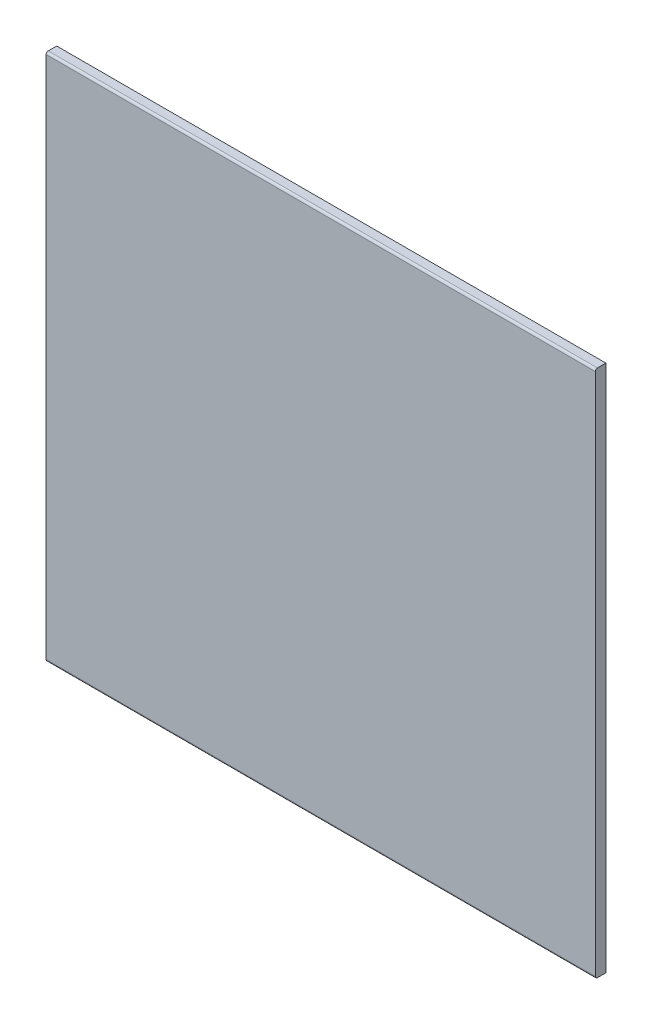
ISO-10303-21;
HEADER;
FILE_DESCRIPTION(('STEP AP214'),'2;1');
FILE_NAME('part.step','',(''),(''),'','','');
FILE_SCHEMA(('AUTOMOTIVE_DESIGN { 1 0 10303 214 1 1 1 1 }'));
ENDSEC;
DATA;
#1=APPLICATION_CONTEXT('core data for automotive mechanical design processes');
#2=APPLICATION_PROTOCOL_DEFINITION('international standard','automotive_design',2000,#1);
#3=PRODUCT_CONTEXT('',#1,'mechanical');
#4=PRODUCT('Part','Part','',(#3));
#5=PRODUCT_RELATED_PRODUCT_CATEGORY('part','',(#4));
#6=PRODUCT_DEFINITION_FORMATION('','',#4);
#7=PRODUCT_DEFINITION_CONTEXT('part definition',#1,'design');
#8=PRODUCT_DEFINITION('design','',#6,#7);
#9=PRODUCT_DEFINITION_SHAPE('','',#8);
#10=(LENGTH_UNIT() NAMED_UNIT(*) SI_UNIT(.MILLI.,.METRE.));
#11=(NAMED_UNIT(*) PLANE_ANGLE_UNIT() SI_UNIT($,.RADIAN.));
#12=(NAMED_UNIT(*) SI_UNIT($,.STERADIAN.) SOLID_ANGLE_UNIT());
#13=UNCERTAINTY_MEASURE_WITH_UNIT(LENGTH_MEASURE(1.E-05),#10,'distance_accuracy_value','');
#14=(GEOMETRIC_REPRESENTATION_CONTEXT(3) GLOBAL_UNCERTAINTY_ASSIGNED_CONTEXT((#13)) GLOBAL_UNIT_ASSIGNED_CONTEXT((#10,
#11,#12)) REPRESENTATION_CONTEXT('',''));
#15=CARTESIAN_POINT('',(0.,0.,0.));
#16=DIRECTION('',(0.,0.,1.));
#17=DIRECTION('',(1.,0.,0.));
#18=AXIS2_PLACEMENT_3D('',#15,#16,#17);
#19=CARTESIAN_POINT('',(0.,0.,0.6));
#20=DIRECTION('',(0.,0.,-1.));
#21=DIRECTION('',(0.,-1.,0.));
#22=AXIS2_PLACEMENT_3D('',#19,#20,#21);
#23=PLANE('',#22);
#24=DIRECTION('',(1.,0.,0.));
#25=VECTOR('',#24,1.);
#26=CARTESIAN_POINT('',(-0.65,1.25,0.6));
#27=LINE('',#26,#25);
#28=CARTESIAN_POINT('',(-1.3,1.25,0.6));
#29=VERTEX_POINT('',#28);
#30=CARTESIAN_POINT('',(1.3,1.25,0.6));
#31=VERTEX_POINT('',#30);
#32=EDGE_CURVE('E130',#29,#31,#27,.T.);
#33=ORIENTED_EDGE('',*,*,#32,.T.);
#34=DIRECTION('',(0.,-1.,0.));
#35=VECTOR('',#34,1.);
#36=CARTESIAN_POINT('',(1.3,0.625,0.6));
#37=LINE('',#36,#35);
#38=CARTESIAN_POINT('',(1.3,-1.25,0.6));
#39=VERTEX_POINT('',#38);
#40=EDGE_CURVE('E11',#31,#39,#37,.T.);
#41=ORIENTED_EDGE('',*,*,#40,.T.);
#42=DIRECTION('',(-1.,0.,0.));
#43=VECTOR('',#42,1.);
#44=CARTESIAN_POINT('',(0.65,-1.25,0.6));
#45=LINE('',#44,#43);
#46=CARTESIAN_POINT('',(-1.3,-1.25,0.6));
#47=VERTEX_POINT('',#46);
#48=EDGE_CURVE('E109',#39,#47,#45,.T.);
#49=ORIENTED_EDGE('',*,*,#48,.T.);
#50=DIRECTION('',(0.,1.,0.));
#51=VECTOR('',#50,1.);
#52=CARTESIAN_POINT('',(-1.3,-0.625,0.6));
#53=LINE('',#52,#51);
#54=EDGE_CURVE('E26',#47,#29,#53,.T.);
#55=ORIENTED_EDGE('',*,*,#54,.T.);
#56=EDGE_LOOP('',(#33,#41,#49,#55));
#57=FACE_BOUND('',#56,.T.);
#58=ADVANCED_FACE('F16',(#57),#23,.T.);
#59=CARTESIAN_POINT('',(1.3,1.25,0.65));
#60=DIRECTION('',(1.,0.,0.));
#61=DIRECTION('',(0.,0.,1.));
#62=AXIS2_PLACEMENT_3D('',#59,#60,#61);
#63=PLANE('',#62);
#64=CARTESIAN_POINT('',(1.3,1.24,0.64));
#65=DIRECTION('',(1.,0.,0.));
#66=DIRECTION('',(0.,0.707106781186548,0.707106781186548));
#67=AXIS2_PLACEMENT_3D('',#64,#65,#66);
#68=CIRCLE('',#67,0.01);
#69=CARTESIAN_POINT('',(1.3,1.25,0.64));
#70=VERTEX_POINT('',#69);
#71=CARTESIAN_POINT('',(1.3,1.24,0.65));
#72=VERTEX_POINT('',#71);
#73=EDGE_CURVE('E129',#70,#72,#68,.T.);
#74=ORIENTED_EDGE('',*,*,#73,.T.);
#75=DIRECTION('',(0.,-1.,0.));
#76=VECTOR('',#75,1.);
#77=CARTESIAN_POINT('',(1.3,0.625,0.65));
#78=LINE('',#77,#76);
#79=CARTESIAN_POINT('',(1.3,-1.24,0.65));
#80=VERTEX_POINT('',#79);
#81=EDGE_CURVE('E86',#72,#80,#78,.T.);
#82=ORIENTED_EDGE('',*,*,#81,.T.);
#83=CARTESIAN_POINT('',(1.3,-1.24,0.64));
#84=DIRECTION('',(-1.,0.,0.));
#85=DIRECTION('',(0.,-0.707106781186548,0.707106781186548));
#86=AXIS2_PLACEMENT_3D('',#83,#84,#85);
#87=CIRCLE('',#86,0.01);
#88=CARTESIAN_POINT('',(1.3,-1.25,0.64));
#89=VERTEX_POINT('',#88);
#90=EDGE_CURVE('E120',#89,#80,#87,.T.);
#91=ORIENTED_EDGE('',*,*,#90,.F.);
#92=DIRECTION('',(0.,0.,1.));
#93=VECTOR('',#92,1.);
#94=CARTESIAN_POINT('',(1.3,-1.25,0.65));
#95=LINE('',#94,#93);
#96=EDGE_CURVE('E110',#39,#89,#95,.T.);
#97=ORIENTED_EDGE('',*,*,#96,.F.);
#98=ORIENTED_EDGE('',*,*,#40,.F.);
#99=DIRECTION('',(0.,0.,1.));
#100=VECTOR('',#99,1.);
#101=CARTESIAN_POINT('',(1.3,1.25,0.65));
#102=LINE('',#101,#100);
#103=EDGE_CURVE('E144',#31,#70,#102,.T.);
#104=ORIENTED_EDGE('',*,*,#103,.T.);
#105=EDGE_LOOP('',(#74,#82,#91,#97,#98,#104));
#106=FACE_BOUND('',#105,.T.);
#107=ADVANCED_FACE('F159',(#106),#63,.T.);
#108=CARTESIAN_POINT('',(-1.3,-1.25,0.65));
#109=DIRECTION('',(-1.,0.,0.));
#110=DIRECTION('',(0.,0.,1.));
#111=AXIS2_PLACEMENT_3D('',#108,#109,#110);
#112=PLANE('',#111);
#113=CARTESIAN_POINT('',(-1.3,1.24,0.64));
#114=DIRECTION('',(-1.,0.,0.));
#115=DIRECTION('',(0.,0.707106781186548,0.707106781186548));
#116=AXIS2_PLACEMENT_3D('',#113,#114,#115);
#117=CIRCLE('',#116,0.01);
#118=CARTESIAN_POINT('',(-1.3,1.24,0.65));
#119=VERTEX_POINT('',#118);
#120=CARTESIAN_POINT('',(-1.3,1.25,0.64));
#121=VERTEX_POINT('',#120);
#122=EDGE_CURVE('E138',#119,#121,#117,.T.);
#123=ORIENTED_EDGE('',*,*,#122,.T.);
#124=DIRECTION('',(0.,0.,-1.));
#125=VECTOR('',#124,1.);
#126=CARTESIAN_POINT('',(-1.3,1.25,0.65));
#127=LINE('',#126,#125);
#128=EDGE_CURVE('E78',#121,#29,#127,.T.);
#129=ORIENTED_EDGE('',*,*,#128,.T.);
#130=ORIENTED_EDGE('',*,*,#54,.F.);
#131=DIRECTION('',(0.,0.,-1.));
#132=VECTOR('',#131,1.);
#133=CARTESIAN_POINT('',(-1.3,-1.25,0.65));
#134=LINE('',#133,#132);
#135=CARTESIAN_POINT('',(-1.3,-1.25,0.64));
#136=VERTEX_POINT('',#135);
#137=EDGE_CURVE('E100',#136,#47,#134,.T.);
#138=ORIENTED_EDGE('',*,*,#137,.F.);
#139=CARTESIAN_POINT('',(-1.3,-1.24,0.64));
#140=DIRECTION('',(-1.,0.,0.));
#141=DIRECTION('',(0.,-0.707106781186548,0.707106781186548));
#142=AXIS2_PLACEMENT_3D('',#139,#140,#141);
#143=CIRCLE('',#142,0.01);
#144=CARTESIAN_POINT('',(-1.3,-1.24,0.65));
#145=VERTEX_POINT('',#144);
#146=EDGE_CURVE('E104',#136,#145,#143,.T.);
#147=ORIENTED_EDGE('',*,*,#146,.T.);
#148=DIRECTION('',(0.,1.,0.));
#149=VECTOR('',#148,1.);
#150=CARTESIAN_POINT('',(-1.3,-0.625,0.65));
#151=LINE('',#150,#149);
#152=EDGE_CURVE('E69',#145,#119,#151,.T.);
#153=ORIENTED_EDGE('',*,*,#152,.T.);
#154=EDGE_LOOP('',(#123,#129,#130,#138,#147,#153));
#155=FACE_BOUND('',#154,.T.);
#156=ADVANCED_FACE('F102',(#155),#112,.T.);
#157=CARTESIAN_POINT('',(1.3,-1.25,0.65));
#158=DIRECTION('',(0.,-1.,0.));
#159=DIRECTION('',(0.,0.,-1.));
#160=AXIS2_PLACEMENT_3D('',#157,#158,#159);
#161=PLANE('',#160);
#162=ORIENTED_EDGE('',*,*,#96,.T.);
#163=DIRECTION('',(1.,0.,0.));
#164=VECTOR('',#163,1.);
#165=CARTESIAN_POINT('',(0.65,-1.25,0.64));
#166=LINE('',#165,#164);
#167=EDGE_CURVE('E19',#136,#89,#166,.T.);
#168=ORIENTED_EDGE('',*,*,#167,.F.);
#169=ORIENTED_EDGE('',*,*,#137,.T.);
#170=ORIENTED_EDGE('',*,*,#48,.F.);
#171=EDGE_LOOP('',(#162,#168,#169,#170));
#172=FACE_BOUND('',#171,.T.);
#173=ADVANCED_FACE('F113',(#172),#161,.T.);
#174=CARTESIAN_POINT('',(0.65,-1.24,0.64));
#175=DIRECTION('',(1.,0.,0.));
#176=DIRECTION('',(0.,-0.707106781186548,0.707106781186548));
#177=AXIS2_PLACEMENT_3D('',#174,#175,#176);
#178=CYLINDRICAL_SURFACE('',#177,0.01);
#179=ORIENTED_EDGE('',*,*,#90,.T.);
#180=DIRECTION('',(1.,0.,0.));
#181=VECTOR('',#180,1.);
#182=CARTESIAN_POINT('',(0.65,-1.24,0.65));
#183=LINE('',#182,#181);
#184=EDGE_CURVE('E118',#145,#80,#183,.T.);
#185=ORIENTED_EDGE('',*,*,#184,.F.);
#186=ORIENTED_EDGE('',*,*,#146,.F.);
#187=ORIENTED_EDGE('',*,*,#167,.T.);
#188=EDGE_LOOP('',(#179,#185,#186,#187));
#189=FACE_BOUND('',#188,.T.);
#190=ADVANCED_FACE('F117',(#189),#178,.T.);
#191=CARTESIAN_POINT('',(0.,0.,0.65));
#192=DIRECTION('',(0.,0.,-1.));
#193=DIRECTION('',(0.,-1.,0.));
#194=AXIS2_PLACEMENT_3D('',#191,#192,#193);
#195=PLANE('',#194);
#196=ORIENTED_EDGE('',*,*,#81,.F.);
#197=DIRECTION('',(-1.,0.,0.));
#198=VECTOR('',#197,1.);
#199=CARTESIAN_POINT('',(-0.65,1.24,0.65));
#200=LINE('',#199,#198);
#201=EDGE_CURVE('E141',#72,#119,#200,.T.);
#202=ORIENTED_EDGE('',*,*,#201,.T.);
#203=ORIENTED_EDGE('',*,*,#152,.F.);
#204=ORIENTED_EDGE('',*,*,#184,.T.);
#205=EDGE_LOOP('',(#196,#202,#203,#204));
#206=FACE_BOUND('',#205,.T.);
#207=ADVANCED_FACE('F168',(#206),#195,.F.);
#208=CARTESIAN_POINT('',(-1.3,1.25,0.65));
#209=DIRECTION('',(0.,1.,0.));
#210=DIRECTION('',(0.,0.,-1.));
#211=AXIS2_PLACEMENT_3D('',#208,#209,#210);
#212=PLANE('',#211);
#213=ORIENTED_EDGE('',*,*,#103,.F.);
#214=ORIENTED_EDGE('',*,*,#32,.F.);
#215=ORIENTED_EDGE('',*,*,#128,.F.);
#216=DIRECTION('',(-1.,0.,0.));
#217=VECTOR('',#216,1.);
#218=CARTESIAN_POINT('',(-0.65,1.25,0.64));
#219=LINE('',#218,#217);
#220=EDGE_CURVE('E134',#70,#121,#219,.T.);
#221=ORIENTED_EDGE('',*,*,#220,.F.);
#222=EDGE_LOOP('',(#213,#214,#215,#221));
#223=FACE_BOUND('',#222,.T.);
#224=ADVANCED_FACE('F170',(#223),#212,.T.);
#225=CARTESIAN_POINT('',(-0.65,1.24,0.64));
#226=DIRECTION('',(-1.,0.,0.));
#227=DIRECTION('',(0.,0.707106781186548,0.707106781186548));
#228=AXIS2_PLACEMENT_3D('',#225,#226,#227);
#229=CYLINDRICAL_SURFACE('',#228,0.01);
#230=ORIENTED_EDGE('',*,*,#73,.F.);
#231=ORIENTED_EDGE('',*,*,#220,.T.);
#232=ORIENTED_EDGE('',*,*,#122,.F.);
#233=ORIENTED_EDGE('',*,*,#201,.F.);
#234=EDGE_LOOP('',(#230,#231,#232,#233));
#235=FACE_BOUND('',#234,.T.);
#236=ADVANCED_FACE('F166',(#235),#229,.T.);
#237=CLOSED_SHELL('',(#58,#107,#156,#173,#190,#207,#224,#236));
#238=MANIFOLD_SOLID_BREP('B1',#237);
#239=ADVANCED_BREP_SHAPE_REPRESENTATION('',(#18,#238),#14);
#240=SHAPE_DEFINITION_REPRESENTATION(#9,#239);
ENDSEC;
END-ISO-10303-21;
